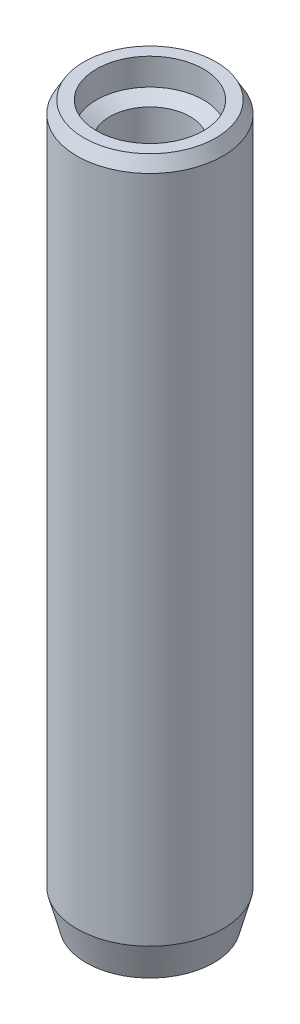
ISO-10303-21;
HEADER;
FILE_DESCRIPTION(('STEP AP214'),'2;1');
FILE_NAME('part.step','',(''),(''),'','','');
FILE_SCHEMA(('AUTOMOTIVE_DESIGN { 1 0 10303 214 1 1 1 1 }'));
ENDSEC;
DATA;
#1=APPLICATION_CONTEXT('core data for automotive mechanical design processes');
#2=APPLICATION_PROTOCOL_DEFINITION('international standard','automotive_design',2000,#1);
#3=PRODUCT_CONTEXT('',#1,'mechanical');
#4=PRODUCT('Part','Part','',(#3));
#5=PRODUCT_RELATED_PRODUCT_CATEGORY('part','',(#4));
#6=PRODUCT_DEFINITION_FORMATION('','',#4);
#7=PRODUCT_DEFINITION_CONTEXT('part definition',#1,'design');
#8=PRODUCT_DEFINITION('design','',#6,#7);
#9=PRODUCT_DEFINITION_SHAPE('','',#8);
#10=(LENGTH_UNIT() NAMED_UNIT(*) SI_UNIT(.MILLI.,.METRE.));
#11=(NAMED_UNIT(*) PLANE_ANGLE_UNIT() SI_UNIT($,.RADIAN.));
#12=(NAMED_UNIT(*) SI_UNIT($,.STERADIAN.) SOLID_ANGLE_UNIT());
#13=UNCERTAINTY_MEASURE_WITH_UNIT(LENGTH_MEASURE(1.E-05),#10,'distance_accuracy_value','');
#14=(GEOMETRIC_REPRESENTATION_CONTEXT(3) GLOBAL_UNCERTAINTY_ASSIGNED_CONTEXT((#13)) GLOBAL_UNIT_ASSIGNED_CONTEXT((#10,
#11,#12)) REPRESENTATION_CONTEXT('',''));
#15=CARTESIAN_POINT('',(0.,0.,0.));
#16=DIRECTION('',(0.,0.,1.));
#17=DIRECTION('',(1.,0.,0.));
#18=AXIS2_PLACEMENT_3D('',#15,#16,#17);
#19=CARTESIAN_POINT('',(0.,6.,0.));
#20=DIRECTION('',(0.,1.,0.));
#21=DIRECTION('',(1.,0.,0.));
#22=AXIS2_PLACEMENT_3D('',#19,#20,#21);
#23=SPHERICAL_SURFACE('',#22,6.);
#24=CARTESIAN_POINT('',(0.,0.605320665129593,0.));
#25=DIRECTION('',(0.,1.,0.));
#26=DIRECTION('',(0.,0.,1.));
#27=AXIS2_PLACEMENT_3D('',#24,#25,#26);
#28=CIRCLE('',#27,2.6262967985211);
#29=CARTESIAN_POINT('',(0.,0.605320665129593,2.6262967985211));
#30=VERTEX_POINT('',#29);
#31=EDGE_CURVE('E11',#30,#30,#28,.T.);
#32=ORIENTED_EDGE('',*,*,#31,.F.);
#33=EDGE_LOOP('',(#32));
#34=FACE_BOUND('',#33,.T.);
#35=ADVANCED_FACE('F40',(#34),#23,.T.);
#36=CARTESIAN_POINT('',(0.,2.,0.));
#37=DIRECTION('',(0.,1.,0.));
#38=DIRECTION('',(0.,0.,1.));
#39=AXIS2_PLACEMENT_3D('',#36,#37,#38);
#40=CONICAL_SURFACE('',#39,3.,0.26179938779915);
#41=ORIENTED_EDGE('',*,*,#31,.T.);
#42=EDGE_LOOP('',(#41));
#43=FACE_BOUND('',#42,.T.);
#44=CARTESIAN_POINT('',(0.,2.,0.));
#45=DIRECTION('',(0.,1.,0.));
#46=DIRECTION('',(0.,0.,1.));
#47=AXIS2_PLACEMENT_3D('',#44,#45,#46);
#48=CIRCLE('',#47,3.);
#49=CARTESIAN_POINT('',(0.,2.,3.));
#50=VERTEX_POINT('',#49);
#51=EDGE_CURVE('E47',#50,#50,#48,.T.);
#52=ORIENTED_EDGE('',*,*,#51,.F.);
#53=EDGE_LOOP('',(#52));
#54=FACE_BOUND('',#53,.T.);
#55=ADVANCED_FACE('F82',(#43,#54),#40,.T.);
#56=CARTESIAN_POINT('',(0.,30.,0.));
#57=DIRECTION('',(0.,1.,0.));
#58=DIRECTION('',(0.,0.,1.));
#59=AXIS2_PLACEMENT_3D('',#56,#57,#58);
#60=CYLINDRICAL_SURFACE('',#59,3.);
#61=ORIENTED_EDGE('',*,*,#51,.T.);
#62=EDGE_LOOP('',(#61));
#63=FACE_BOUND('',#62,.T.);
#64=CARTESIAN_POINT('',(0.,29.5,0.));
#65=DIRECTION('',(0.,1.,0.));
#66=DIRECTION('',(0.,0.,1.));
#67=AXIS2_PLACEMENT_3D('',#64,#65,#66);
#68=CIRCLE('',#67,3.);
#69=CARTESIAN_POINT('',(0.,29.5,3.));
#70=VERTEX_POINT('',#69);
#71=EDGE_CURVE('E74',#70,#70,#68,.T.);
#72=ORIENTED_EDGE('',*,*,#71,.F.);
#73=EDGE_LOOP('',(#72));
#74=FACE_BOUND('',#73,.T.);
#75=ADVANCED_FACE('F79',(#63,#74),#60,.T.);
#76=CARTESIAN_POINT('',(0.,30.,0.));
#77=DIRECTION('',(0.,-1.,0.));
#78=DIRECTION('',(0.,0.,-1.));
#79=AXIS2_PLACEMENT_3D('',#76,#77,#78);
#80=CONICAL_SURFACE('',#79,2.71132486540519,0.523598775598301);
#81=ORIENTED_EDGE('',*,*,#71,.T.);
#82=EDGE_LOOP('',(#81));
#83=FACE_BOUND('',#82,.T.);
#84=CARTESIAN_POINT('',(0.,30.,0.));
#85=DIRECTION('',(0.,1.,0.));
#86=DIRECTION('',(0.,0.,1.));
#87=AXIS2_PLACEMENT_3D('',#84,#85,#86);
#88=CIRCLE('',#87,2.71132486540519);
#89=CARTESIAN_POINT('',(0.,30.,2.71132486540519));
#90=VERTEX_POINT('',#89);
#91=EDGE_CURVE('E70',#90,#90,#88,.T.);
#92=ORIENTED_EDGE('',*,*,#91,.F.);
#93=EDGE_LOOP('',(#92));
#94=FACE_BOUND('',#93,.T.);
#95=ADVANCED_FACE('F89',(#83,#94),#80,.T.);
#96=CARTESIAN_POINT('',(0.,30.,0.));
#97=DIRECTION('',(0.,1.,0.));
#98=DIRECTION('',(0.,0.,1.));
#99=AXIS2_PLACEMENT_3D('',#96,#97,#98);
#100=PLANE('',#99);
#101=ORIENTED_EDGE('',*,*,#91,.T.);
#102=EDGE_LOOP('',(#101));
#103=FACE_BOUND('',#102,.T.);
#104=CARTESIAN_POINT('',(0.,30.,0.));
#105=DIRECTION('',(0.,1.,0.));
#106=DIRECTION('',(0.,0.,1.));
#107=AXIS2_PLACEMENT_3D('',#104,#105,#106);
#108=CIRCLE('',#107,2.2);
#109=CARTESIAN_POINT('',(0.,30.,2.2));
#110=VERTEX_POINT('',#109);
#111=EDGE_CURVE('E67',#110,#110,#108,.T.);
#112=ORIENTED_EDGE('',*,*,#111,.F.);
#113=EDGE_LOOP('',(#112));
#114=FACE_BOUND('',#113,.T.);
#115=ADVANCED_FACE('F95',(#103,#114),#100,.T.);
#116=CARTESIAN_POINT('',(0.,30.,0.));
#117=DIRECTION('',(0.,1.,0.));
#118=DIRECTION('',(0.,0.,1.));
#119=AXIS2_PLACEMENT_3D('',#116,#117,#118);
#120=CYLINDRICAL_SURFACE('',#119,2.2);
#121=CARTESIAN_POINT('',(0.,28.9,0.));
#122=DIRECTION('',(0.,1.,0.));
#123=DIRECTION('',(0.,0.,1.));
#124=AXIS2_PLACEMENT_3D('',#121,#122,#123);
#125=CIRCLE('',#124,2.2);
#126=CARTESIAN_POINT('',(0.,28.9,2.2));
#127=VERTEX_POINT('',#126);
#128=EDGE_CURVE('E62',#127,#127,#125,.T.);
#129=ORIENTED_EDGE('',*,*,#128,.F.);
#130=EDGE_LOOP('',(#129));
#131=FACE_BOUND('',#130,.T.);
#132=ORIENTED_EDGE('',*,*,#111,.T.);
#133=EDGE_LOOP('',(#132));
#134=FACE_BOUND('',#133,.T.);
#135=ADVANCED_FACE('F99',(#131,#134),#120,.F.);
#136=CARTESIAN_POINT('',(0.,28.9,0.));
#137=DIRECTION('',(0.,1.,0.));
#138=DIRECTION('',(0.,0.,1.));
#139=AXIS2_PLACEMENT_3D('',#136,#137,#138);
#140=CONICAL_SURFACE('',#139,2.2,1.0471975511966);
#141=CARTESIAN_POINT('',(0.,28.5824573519457,0.));
#142=DIRECTION('',(0.,1.,0.));
#143=DIRECTION('',(0.,0.,1.));
#144=AXIS2_PLACEMENT_3D('',#141,#142,#143);
#145=CIRCLE('',#144,1.65);
#146=CARTESIAN_POINT('',(0.,28.5824573519457,1.65));
#147=VERTEX_POINT('',#146);
#148=EDGE_CURVE('E59',#147,#147,#145,.T.);
#149=ORIENTED_EDGE('',*,*,#148,.F.);
#150=EDGE_LOOP('',(#149));
#151=FACE_BOUND('',#150,.T.);
#152=ORIENTED_EDGE('',*,*,#128,.T.);
#153=EDGE_LOOP('',(#152));
#154=FACE_BOUND('',#153,.T.);
#155=ADVANCED_FACE('F103',(#151,#154),#140,.F.);
#156=CARTESIAN_POINT('',(0.,30.,0.));
#157=DIRECTION('',(0.,1.,0.));
#158=DIRECTION('',(0.,0.,1.));
#159=AXIS2_PLACEMENT_3D('',#156,#157,#158);
#160=CYLINDRICAL_SURFACE('',#159,1.65);
#161=CARTESIAN_POINT('',(0.,20.,0.));
#162=DIRECTION('',(0.,1.,0.));
#163=DIRECTION('',(0.,0.,1.));
#164=AXIS2_PLACEMENT_3D('',#161,#162,#163);
#165=CIRCLE('',#164,1.65);
#166=CARTESIAN_POINT('',(0.,20.,1.65));
#167=VERTEX_POINT('',#166);
#168=EDGE_CURVE('E57',#167,#167,#165,.T.);
#169=ORIENTED_EDGE('',*,*,#168,.F.);
#170=EDGE_LOOP('',(#169));
#171=FACE_BOUND('',#170,.T.);
#172=ORIENTED_EDGE('',*,*,#148,.T.);
#173=EDGE_LOOP('',(#172));
#174=FACE_BOUND('',#173,.T.);
#175=ADVANCED_FACE('F53',(#171,#174),#160,.F.);
#176=CARTESIAN_POINT('',(0.,20.,0.));
#177=DIRECTION('',(0.,1.,0.));
#178=DIRECTION('',(0.,0.,1.));
#179=AXIS2_PLACEMENT_3D('',#176,#177,#178);
#180=CONICAL_SURFACE('',#179,1.65,1.02974425867665);
#181=CARTESIAN_POINT('',(0.,19.0085799786045,0.));
#182=VERTEX_POINT('',#181);
#183=VERTEX_LOOP('',#182);
#184=FACE_BOUND('',#183,.T.);
#185=ORIENTED_EDGE('',*,*,#168,.T.);
#186=EDGE_LOOP('',(#185));
#187=FACE_BOUND('',#186,.T.);
#188=ADVANCED_FACE('F50',(#184,#187),#180,.F.);
#189=CLOSED_SHELL('',(#35,#55,#75,#95,#115,#135,#155,#175,#188));
#190=MANIFOLD_SOLID_BREP('B2',#189);
#191=ADVANCED_BREP_SHAPE_REPRESENTATION('',(#18,#190),#14);
#192=SHAPE_DEFINITION_REPRESENTATION(#9,#191);
ENDSEC;
END-ISO-10303-21;
